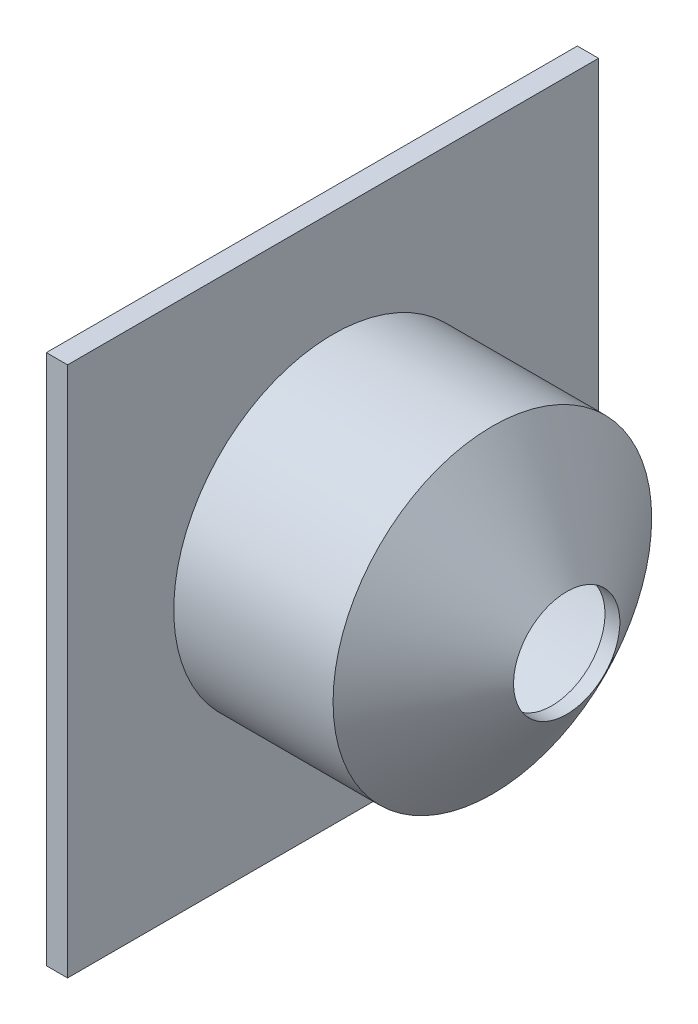
ISO-10303-21;
HEADER;
FILE_DESCRIPTION(('STEP AP214'),'2;1');
FILE_NAME('part.step','',(''),(''),'','','');
FILE_SCHEMA(('AUTOMOTIVE_DESIGN { 1 0 10303 214 1 1 1 1 }'));
ENDSEC;
DATA;
#1=APPLICATION_CONTEXT('core data for automotive mechanical design processes');
#2=APPLICATION_PROTOCOL_DEFINITION('international standard','automotive_design',2000,#1);
#3=PRODUCT_CONTEXT('',#1,'mechanical');
#4=PRODUCT('Part','Part','',(#3));
#5=PRODUCT_RELATED_PRODUCT_CATEGORY('part','',(#4));
#6=PRODUCT_DEFINITION_FORMATION('','',#4);
#7=PRODUCT_DEFINITION_CONTEXT('part definition',#1,'design');
#8=PRODUCT_DEFINITION('design','',#6,#7);
#9=PRODUCT_DEFINITION_SHAPE('','',#8);
#10=(LENGTH_UNIT() NAMED_UNIT(*) SI_UNIT(.MILLI.,.METRE.));
#11=(NAMED_UNIT(*) PLANE_ANGLE_UNIT() SI_UNIT($,.RADIAN.));
#12=(NAMED_UNIT(*) SI_UNIT($,.STERADIAN.) SOLID_ANGLE_UNIT());
#13=UNCERTAINTY_MEASURE_WITH_UNIT(LENGTH_MEASURE(1.E-05),#10,'distance_accuracy_value','');
#14=(GEOMETRIC_REPRESENTATION_CONTEXT(3) GLOBAL_UNCERTAINTY_ASSIGNED_CONTEXT((#13)) GLOBAL_UNIT_ASSIGNED_CONTEXT((#10,
#11,#12)) REPRESENTATION_CONTEXT('',''));
#15=CARTESIAN_POINT('',(0.,0.,0.));
#16=DIRECTION('',(0.,0.,1.));
#17=DIRECTION('',(1.,0.,0.));
#18=AXIS2_PLACEMENT_3D('',#15,#16,#17);
#19=CARTESIAN_POINT('',(2.,0.,-25.));
#20=DIRECTION('',(0.,0.,-1.));
#21=DIRECTION('',(0.,1.,0.));
#22=AXIS2_PLACEMENT_3D('',#19,#20,#21);
#23=PLANE('',#22);
#24=DIRECTION('',(0.,-1.,0.));
#25=VECTOR('',#24,1.);
#26=CARTESIAN_POINT('',(0.,0.,-25.));
#27=LINE('',#26,#25);
#28=CARTESIAN_POINT('',(0.,25.,-25.));
#29=VERTEX_POINT('',#28);
#30=CARTESIAN_POINT('',(0.,-25.,-25.));
#31=VERTEX_POINT('',#30);
#32=EDGE_CURVE('E112',#29,#31,#27,.T.);
#33=ORIENTED_EDGE('',*,*,#32,.F.);
#34=DIRECTION('',(-1.,0.,0.));
#35=VECTOR('',#34,1.);
#36=CARTESIAN_POINT('',(2.,25.,-25.));
#37=LINE('',#36,#35);
#38=CARTESIAN_POINT('',(2.,25.,-25.));
#39=VERTEX_POINT('',#38);
#40=EDGE_CURVE('E12',#39,#29,#37,.T.);
#41=ORIENTED_EDGE('',*,*,#40,.F.);
#42=DIRECTION('',(0.,-1.,0.));
#43=VECTOR('',#42,1.);
#44=CARTESIAN_POINT('',(2.,0.,-25.));
#45=LINE('',#44,#43);
#46=CARTESIAN_POINT('',(2.,-25.,-25.));
#47=VERTEX_POINT('',#46);
#48=EDGE_CURVE('E102',#39,#47,#45,.T.);
#49=ORIENTED_EDGE('',*,*,#48,.T.);
#50=DIRECTION('',(-1.,0.,0.));
#51=VECTOR('',#50,1.);
#52=CARTESIAN_POINT('',(2.,-25.,-25.));
#53=LINE('',#52,#51);
#54=EDGE_CURVE('E81',#47,#31,#53,.T.);
#55=ORIENTED_EDGE('',*,*,#54,.T.);
#56=EDGE_LOOP('',(#33,#41,#49,#55));
#57=FACE_BOUND('',#56,.T.);
#58=ADVANCED_FACE('F41',(#57),#23,.T.);
#59=CARTESIAN_POINT('',(2.,25.,0.));
#60=DIRECTION('',(0.,1.,0.));
#61=DIRECTION('',(0.,0.,1.));
#62=AXIS2_PLACEMENT_3D('',#59,#60,#61);
#63=PLANE('',#62);
#64=DIRECTION('',(0.,0.,-1.));
#65=VECTOR('',#64,1.);
#66=CARTESIAN_POINT('',(0.,25.,0.));
#67=LINE('',#66,#65);
#68=CARTESIAN_POINT('',(0.,25.,25.));
#69=VERTEX_POINT('',#68);
#70=EDGE_CURVE('E93',#69,#29,#67,.T.);
#71=ORIENTED_EDGE('',*,*,#70,.F.);
#72=DIRECTION('',(-1.,0.,0.));
#73=VECTOR('',#72,1.);
#74=CARTESIAN_POINT('',(2.,25.,25.));
#75=LINE('',#74,#73);
#76=CARTESIAN_POINT('',(2.,25.,25.));
#77=VERTEX_POINT('',#76);
#78=EDGE_CURVE('E50',#77,#69,#75,.T.);
#79=ORIENTED_EDGE('',*,*,#78,.F.);
#80=DIRECTION('',(0.,0.,-1.));
#81=VECTOR('',#80,1.);
#82=CARTESIAN_POINT('',(2.,25.,0.));
#83=LINE('',#82,#81);
#84=EDGE_CURVE('E91',#77,#39,#83,.T.);
#85=ORIENTED_EDGE('',*,*,#84,.T.);
#86=ORIENTED_EDGE('',*,*,#40,.T.);
#87=EDGE_LOOP('',(#71,#79,#85,#86));
#88=FACE_BOUND('',#87,.T.);
#89=ADVANCED_FACE('F89',(#88),#63,.T.);
#90=CARTESIAN_POINT('',(2.,0.,25.));
#91=DIRECTION('',(0.,0.,-1.));
#92=DIRECTION('',(-1.,0.,0.));
#93=AXIS2_PLACEMENT_3D('',#90,#91,#92);
#94=PLANE('',#93);
#95=DIRECTION('',(0.,-1.,0.));
#96=VECTOR('',#95,1.);
#97=CARTESIAN_POINT('',(0.,0.,25.));
#98=LINE('',#97,#96);
#99=CARTESIAN_POINT('',(0.,-25.,25.));
#100=VERTEX_POINT('',#99);
#101=EDGE_CURVE('E115',#69,#100,#98,.T.);
#102=ORIENTED_EDGE('',*,*,#101,.T.);
#103=DIRECTION('',(-1.,0.,0.));
#104=VECTOR('',#103,1.);
#105=CARTESIAN_POINT('',(2.,-25.,25.));
#106=LINE('',#105,#104);
#107=CARTESIAN_POINT('',(2.,-25.,25.));
#108=VERTEX_POINT('',#107);
#109=EDGE_CURVE('E96',#108,#100,#106,.T.);
#110=ORIENTED_EDGE('',*,*,#109,.F.);
#111=DIRECTION('',(0.,-1.,0.));
#112=VECTOR('',#111,1.);
#113=CARTESIAN_POINT('',(2.,0.,25.));
#114=LINE('',#113,#112);
#115=EDGE_CURVE('E98',#77,#108,#114,.T.);
#116=ORIENTED_EDGE('',*,*,#115,.F.);
#117=ORIENTED_EDGE('',*,*,#78,.T.);
#118=EDGE_LOOP('',(#102,#110,#116,#117));
#119=FACE_BOUND('',#118,.T.);
#120=ADVANCED_FACE('F99',(#119),#94,.F.);
#121=CARTESIAN_POINT('',(2.,0.,0.));
#122=DIRECTION('',(-1.,0.,0.));
#123=DIRECTION('',(0.,0.,1.));
#124=AXIS2_PLACEMENT_3D('',#121,#122,#123);
#125=CYLINDRICAL_SURFACE('',#124,15.);
#126=CARTESIAN_POINT('',(2.,0.,0.));
#127=DIRECTION('',(1.,0.,0.));
#128=DIRECTION('',(0.,0.,-1.));
#129=AXIS2_PLACEMENT_3D('',#126,#127,#128);
#130=CIRCLE('',#129,15.);
#131=CARTESIAN_POINT('',(2.,0.,-15.));
#132=VERTEX_POINT('',#131);
#133=EDGE_CURVE('E104',#132,#132,#130,.T.);
#134=ORIENTED_EDGE('',*,*,#133,.T.);
#135=EDGE_LOOP('',(#134));
#136=FACE_BOUND('',#135,.T.);
#137=CARTESIAN_POINT('',(0.,0.,0.));
#138=DIRECTION('',(1.,0.,0.));
#139=DIRECTION('',(0.,0.,-1.));
#140=AXIS2_PLACEMENT_3D('',#137,#138,#139);
#141=CIRCLE('',#140,15.);
#142=CARTESIAN_POINT('',(0.,0.,-15.));
#143=VERTEX_POINT('',#142);
#144=EDGE_CURVE('E109',#143,#143,#141,.T.);
#145=ORIENTED_EDGE('',*,*,#144,.F.);
#146=EDGE_LOOP('',(#145));
#147=FACE_BOUND('',#146,.T.);
#148=ADVANCED_FACE('F43',(#136,#147),#125,.F.);
#149=CARTESIAN_POINT('',(2.,-25.,0.));
#150=DIRECTION('',(0.,1.,0.));
#151=DIRECTION('',(0.,0.,1.));
#152=AXIS2_PLACEMENT_3D('',#149,#150,#151);
#153=PLANE('',#152);
#154=DIRECTION('',(0.,0.,-1.));
#155=VECTOR('',#154,1.);
#156=CARTESIAN_POINT('',(0.,-25.,0.));
#157=LINE('',#156,#155);
#158=EDGE_CURVE('E74',#100,#31,#157,.T.);
#159=ORIENTED_EDGE('',*,*,#158,.T.);
#160=ORIENTED_EDGE('',*,*,#54,.F.);
#161=DIRECTION('',(0.,0.,-1.));
#162=VECTOR('',#161,1.);
#163=CARTESIAN_POINT('',(2.,-25.,0.));
#164=LINE('',#163,#162);
#165=EDGE_CURVE('E58',#108,#47,#164,.T.);
#166=ORIENTED_EDGE('',*,*,#165,.F.);
#167=ORIENTED_EDGE('',*,*,#109,.T.);
#168=EDGE_LOOP('',(#159,#160,#166,#167));
#169=FACE_BOUND('',#168,.T.);
#170=ADVANCED_FACE('F120',(#169),#153,.F.);
#171=CARTESIAN_POINT('',(2.,0.,0.));
#172=DIRECTION('',(1.,0.,0.));
#173=DIRECTION('',(0.,0.,-1.));
#174=AXIS2_PLACEMENT_3D('',#171,#172,#173);
#175=PLANE('',#174);
#176=ORIENTED_EDGE('',*,*,#133,.F.);
#177=EDGE_LOOP('',(#176));
#178=FACE_BOUND('',#177,.T.);
#179=ORIENTED_EDGE('',*,*,#48,.F.);
#180=ORIENTED_EDGE('',*,*,#84,.F.);
#181=ORIENTED_EDGE('',*,*,#115,.T.);
#182=ORIENTED_EDGE('',*,*,#165,.T.);
#183=EDGE_LOOP('',(#179,#180,#181,#182));
#184=FACE_BOUND('',#183,.T.);
#185=ADVANCED_FACE('F101',(#178,#184),#175,.T.);
#186=CARTESIAN_POINT('',(0.,0.,0.));
#187=DIRECTION('',(1.,0.,0.));
#188=DIRECTION('',(0.,0.,-1.));
#189=AXIS2_PLACEMENT_3D('',#186,#187,#188);
#190=PLANE('',#189);
#191=ORIENTED_EDGE('',*,*,#144,.T.);
#192=EDGE_LOOP('',(#191));
#193=FACE_BOUND('',#192,.T.);
#194=ORIENTED_EDGE('',*,*,#32,.T.);
#195=ORIENTED_EDGE('',*,*,#158,.F.);
#196=ORIENTED_EDGE('',*,*,#101,.F.);
#197=ORIENTED_EDGE('',*,*,#70,.T.);
#198=EDGE_LOOP('',(#194,#195,#196,#197));
#199=FACE_BOUND('',#198,.T.);
#200=ADVANCED_FACE('F121',(#193,#199),#190,.F.);
#201=CLOSED_SHELL('',(#58,#89,#120,#148,#170,#185,#200));
#202=MANIFOLD_SOLID_BREP('B2',#201);
#203=CARTESIAN_POINT('',(17.,0.,0.));
#204=DIRECTION('',(-1.,0.,0.));
#205=DIRECTION('',(0.,0.,1.));
#206=AXIS2_PLACEMENT_3D('',#203,#204,#205);
#207=CYLINDRICAL_SURFACE('',#206,13.);
#208=CARTESIAN_POINT('',(17.,0.,0.));
#209=DIRECTION('',(-1.,0.,0.));
#210=DIRECTION('',(0.,0.,1.));
#211=AXIS2_PLACEMENT_3D('',#208,#209,#210);
#212=CIRCLE('',#211,13.);
#213=CARTESIAN_POINT('',(17.,0.,13.));
#214=VERTEX_POINT('',#213);
#215=EDGE_CURVE('E209',#214,#214,#212,.T.);
#216=ORIENTED_EDGE('',*,*,#215,.F.);
#217=EDGE_LOOP('',(#216));
#218=FACE_BOUND('',#217,.T.);
#219=CARTESIAN_POINT('',(0.,0.,0.));
#220=DIRECTION('',(1.,0.,0.));
#221=DIRECTION('',(0.,0.,-1.));
#222=AXIS2_PLACEMENT_3D('',#219,#220,#221);
#223=CIRCLE('',#222,13.);
#224=CARTESIAN_POINT('',(0.,0.,-13.));
#225=VERTEX_POINT('',#224);
#226=EDGE_CURVE('E197',#225,#225,#223,.T.);
#227=ORIENTED_EDGE('',*,*,#226,.F.);
#228=EDGE_LOOP('',(#227));
#229=FACE_BOUND('',#228,.T.);
#230=ADVANCED_FACE('F186',(#218,#229),#207,.F.);
#231=CARTESIAN_POINT('',(17.,0.,0.));
#232=DIRECTION('',(-1.,0.,0.));
#233=DIRECTION('',(0.,0.,1.));
#234=AXIS2_PLACEMENT_3D('',#231,#232,#233);
#235=CYLINDRICAL_SURFACE('',#234,15.);
#236=CARTESIAN_POINT('',(17.,0.,0.));
#237=DIRECTION('',(1.,0.,0.));
#238=DIRECTION('',(0.,0.,-1.));
#239=AXIS2_PLACEMENT_3D('',#236,#237,#238);
#240=CIRCLE('',#239,15.);
#241=CARTESIAN_POINT('',(17.,0.,-15.));
#242=VERTEX_POINT('',#241);
#243=EDGE_CURVE('E40',#242,#242,#240,.T.);
#244=ORIENTED_EDGE('',*,*,#243,.F.);
#245=EDGE_LOOP('',(#244));
#246=FACE_BOUND('',#245,.T.);
#247=CARTESIAN_POINT('',(0.,0.,0.));
#248=DIRECTION('',(1.,0.,0.));
#249=DIRECTION('',(0.,0.,-1.));
#250=AXIS2_PLACEMENT_3D('',#247,#248,#249);
#251=CIRCLE('',#250,15.);
#252=CARTESIAN_POINT('',(0.,0.,-15.));
#253=VERTEX_POINT('',#252);
#254=EDGE_CURVE('E189',#253,#253,#251,.T.);
#255=ORIENTED_EDGE('',*,*,#254,.T.);
#256=EDGE_LOOP('',(#255));
#257=FACE_BOUND('',#256,.T.);
#258=ADVANCED_FACE('F220',(#246,#257),#235,.T.);
#259=CARTESIAN_POINT('',(0.,0.,0.));
#260=DIRECTION('',(1.,0.,0.));
#261=DIRECTION('',(0.,0.,-1.));
#262=AXIS2_PLACEMENT_3D('',#259,#260,#261);
#263=PLANE('',#262);
#264=ORIENTED_EDGE('',*,*,#226,.T.);
#265=EDGE_LOOP('',(#264));
#266=FACE_BOUND('',#265,.T.);
#267=ORIENTED_EDGE('',*,*,#254,.F.);
#268=EDGE_LOOP('',(#267));
#269=FACE_BOUND('',#268,.T.);
#270=ADVANCED_FACE('F224',(#266,#269),#263,.F.);
#271=CARTESIAN_POINT('',(17.,0.,0.));
#272=DIRECTION('',(-1.,0.,0.));
#273=DIRECTION('',(0.,0.,1.));
#274=AXIS2_PLACEMENT_3D('',#271,#272,#273);
#275=CONICAL_SURFACE('',#274,13.,0.959931088596884);
#276=CARTESIAN_POINT('',(22.5972174470633,0.,0.));
#277=DIRECTION('',(-1.,0.,0.));
#278=DIRECTION('',(0.,0.,1.));
#279=AXIS2_PLACEMENT_3D('',#276,#277,#278);
#280=CIRCLE('',#279,5.00634505967428);
#281=CARTESIAN_POINT('',(22.5972174470633,0.,5.00634505967428));
#282=VERTEX_POINT('',#281);
#283=EDGE_CURVE('E199',#282,#282,#280,.T.);
#284=ORIENTED_EDGE('',*,*,#283,.F.);
#285=EDGE_LOOP('',(#284));
#286=FACE_BOUND('',#285,.T.);
#287=ORIENTED_EDGE('',*,*,#215,.T.);
#288=EDGE_LOOP('',(#287));
#289=FACE_BOUND('',#288,.T.);
#290=ADVANCED_FACE('F216',(#286,#289),#275,.F.);
#291=CARTESIAN_POINT('',(-1.32201978028119,0.,0.));
#292=DIRECTION('',(-1.,0.,0.));
#293=DIRECTION('',(0.,0.,1.));
#294=AXIS2_PLACEMENT_3D('',#291,#292,#293);
#295=CYLINDRICAL_SURFACE('',#294,5.00634505967428);
#296=CARTESIAN_POINT('',(23.9976325234827,0.,0.));
#297=DIRECTION('',(-1.,0.,0.));
#298=DIRECTION('',(0.,0.,1.));
#299=AXIS2_PLACEMENT_3D('',#296,#297,#298);
#300=CIRCLE('',#299,5.00634505967428);
#301=CARTESIAN_POINT('',(23.9976325234827,0.,5.00634505967428));
#302=VERTEX_POINT('',#301);
#303=EDGE_CURVE('E205',#302,#302,#300,.T.);
#304=ORIENTED_EDGE('',*,*,#303,.F.);
#305=EDGE_LOOP('',(#304));
#306=FACE_BOUND('',#305,.T.);
#307=ORIENTED_EDGE('',*,*,#283,.T.);
#308=EDGE_LOOP('',(#307));
#309=FACE_BOUND('',#308,.T.);
#310=ADVANCED_FACE('F234',(#306,#309),#295,.F.);
#311=CARTESIAN_POINT('',(17.,0.,0.));
#312=DIRECTION('',(-1.,0.,0.));
#313=DIRECTION('',(0.,0.,1.));
#314=AXIS2_PLACEMENT_3D('',#311,#312,#313);
#315=CONICAL_SURFACE('',#314,15.,0.959931088596884);
#316=ORIENTED_EDGE('',*,*,#303,.T.);
#317=EDGE_LOOP('',(#316));
#318=FACE_BOUND('',#317,.T.);
#319=ORIENTED_EDGE('',*,*,#243,.T.);
#320=EDGE_LOOP('',(#319));
#321=FACE_BOUND('',#320,.T.);
#322=ADVANCED_FACE('F238',(#318,#321),#315,.T.);
#323=CLOSED_SHELL('',(#230,#258,#270,#290,#310,#322));
#324=MANIFOLD_SOLID_BREP('B6',#323);
#325=ADVANCED_BREP_SHAPE_REPRESENTATION('',(#18,#202,#324),#14);
#326=SHAPE_DEFINITION_REPRESENTATION(#9,#325);
ENDSEC;
END-ISO-10303-21;
